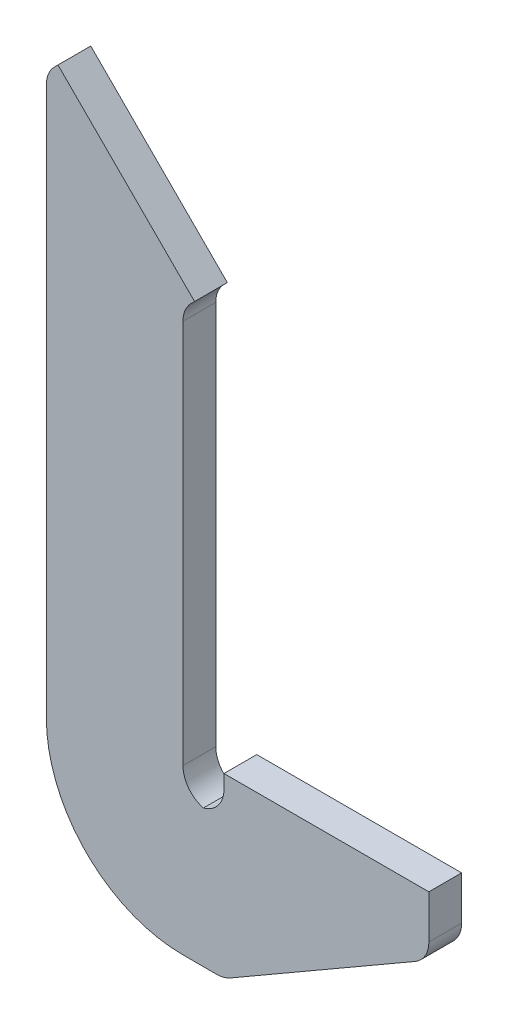
ISO-10303-21;
HEADER;
FILE_DESCRIPTION(('STEP AP214'),'2;1');
FILE_NAME('part.step','',(''),(''),'','','');
FILE_SCHEMA(('AUTOMOTIVE_DESIGN { 1 0 10303 214 1 1 1 1 }'));
ENDSEC;
DATA;
#1=APPLICATION_CONTEXT('core data for automotive mechanical design processes');
#2=APPLICATION_PROTOCOL_DEFINITION('international standard','automotive_design',2000,#1);
#3=PRODUCT_CONTEXT('',#1,'mechanical');
#4=PRODUCT('Part','Part','',(#3));
#5=PRODUCT_RELATED_PRODUCT_CATEGORY('part','',(#4));
#6=PRODUCT_DEFINITION_FORMATION('','',#4);
#7=PRODUCT_DEFINITION_CONTEXT('part definition',#1,'design');
#8=PRODUCT_DEFINITION('design','',#6,#7);
#9=PRODUCT_DEFINITION_SHAPE('','',#8);
#10=(LENGTH_UNIT() NAMED_UNIT(*) SI_UNIT(.MILLI.,.METRE.));
#11=(NAMED_UNIT(*) PLANE_ANGLE_UNIT() SI_UNIT($,.RADIAN.));
#12=(NAMED_UNIT(*) SI_UNIT($,.STERADIAN.) SOLID_ANGLE_UNIT());
#13=UNCERTAINTY_MEASURE_WITH_UNIT(LENGTH_MEASURE(1.E-05),#10,'distance_accuracy_value','');
#14=(GEOMETRIC_REPRESENTATION_CONTEXT(3) GLOBAL_UNCERTAINTY_ASSIGNED_CONTEXT((#13)) GLOBAL_UNIT_ASSIGNED_CONTEXT((#10,
#11,#12)) REPRESENTATION_CONTEXT('',''));
#15=CARTESIAN_POINT('',(0.,0.,0.));
#16=DIRECTION('',(0.,0.,1.));
#17=DIRECTION('',(1.,0.,0.));
#18=AXIS2_PLACEMENT_3D('',#15,#16,#17);
#19=CARTESIAN_POINT('',(-2.71514718625761,3.88485281374241,0.12));
#20=DIRECTION('',(0.707106781186544,-0.707106781186551,0.));
#21=DIRECTION('',(0.707106781186551,0.707106781186544,0.));
#22=AXIS2_PLACEMENT_3D('',#19,#20,#21);
#23=PLANE('',#22);
#24=DIRECTION('',(-0.707106781186551,-0.707106781186544,0.));
#25=VECTOR('',#24,1.);
#26=CARTESIAN_POINT('',(-2.71514718625761,3.88485281374241,-0.12));
#27=LINE('',#26,#25);
#28=CARTESIAN_POINT('',(-2.71514718625761,3.88485281374241,-0.12));
#29=VERTEX_POINT('',#28);
#30=CARTESIAN_POINT('',(-2.74142135623731,3.85857864376271,-0.12));
#31=VERTEX_POINT('',#30);
#32=EDGE_CURVE('E245',#29,#31,#27,.T.);
#33=ORIENTED_EDGE('',*,*,#32,.T.);
#34=DIRECTION('',(0.,0.,-1.));
#35=VECTOR('',#34,1.);
#36=CARTESIAN_POINT('',(-2.74142135623731,3.85857864376271,0.12));
#37=LINE('',#36,#35);
#38=CARTESIAN_POINT('',(-2.74142135623731,3.85857864376271,0.12));
#39=VERTEX_POINT('',#38);
#40=EDGE_CURVE('E326',#31,#39,#37,.F.);
#41=ORIENTED_EDGE('',*,*,#40,.T.);
#42=DIRECTION('',(-0.707106781186551,-0.707106781186544,0.));
#43=VECTOR('',#42,1.);
#44=CARTESIAN_POINT('',(-2.71514718625761,3.88485281374241,0.12));
#45=LINE('',#44,#43);
#46=CARTESIAN_POINT('',(-2.71514718625761,3.88485281374241,0.12));
#47=VERTEX_POINT('',#46);
#48=EDGE_CURVE('E279',#47,#39,#45,.T.);
#49=ORIENTED_EDGE('',*,*,#48,.F.);
#50=DIRECTION('',(0.,0.,-1.));
#51=VECTOR('',#50,1.);
#52=CARTESIAN_POINT('',(-2.71514718625761,3.88485281374241,0.12));
#53=LINE('',#52,#51);
#54=EDGE_CURVE('E244',#47,#29,#53,.T.);
#55=ORIENTED_EDGE('',*,*,#54,.T.);
#56=EDGE_LOOP('',(#33,#41,#49,#55));
#57=FACE_BOUND('',#56,.T.);
#58=ADVANCED_FACE('F44',(#57),#23,.F.);
#59=CARTESIAN_POINT('',(-2.8,3.80000000000002,0.12));
#60=DIRECTION('',(1.,0.,0.));
#61=DIRECTION('',(0.,1.,0.));
#62=AXIS2_PLACEMENT_3D('',#59,#60,#61);
#63=PLANE('',#62);
#64=DIRECTION('',(0.,-1.,0.));
#65=VECTOR('',#64,1.);
#66=CARTESIAN_POINT('',(-2.8,3.80000000000002,0.12));
#67=LINE('',#66,#65);
#68=CARTESIAN_POINT('',(-2.8,3.7171572875254,0.12));
#69=VERTEX_POINT('',#68);
#70=CARTESIAN_POINT('',(-2.8,-0.3,0.12));
#71=VERTEX_POINT('',#70);
#72=EDGE_CURVE('E371',#69,#71,#67,.T.);
#73=ORIENTED_EDGE('',*,*,#72,.F.);
#74=DIRECTION('',(0.,0.,-1.));
#75=VECTOR('',#74,1.);
#76=CARTESIAN_POINT('',(-2.8,3.7171572875254,0.12));
#77=LINE('',#76,#75);
#78=CARTESIAN_POINT('',(-2.8,3.7171572875254,-0.12));
#79=VERTEX_POINT('',#78);
#80=EDGE_CURVE('E313',#69,#79,#77,.T.);
#81=ORIENTED_EDGE('',*,*,#80,.T.);
#82=DIRECTION('',(0.,-1.,0.));
#83=VECTOR('',#82,1.);
#84=CARTESIAN_POINT('',(-2.8,3.80000000000002,-0.12));
#85=LINE('',#84,#83);
#86=CARTESIAN_POINT('',(-2.8,-0.3,-0.12));
#87=VERTEX_POINT('',#86);
#88=EDGE_CURVE('E249',#79,#87,#85,.T.);
#89=ORIENTED_EDGE('',*,*,#88,.T.);
#90=DIRECTION('',(0.,0.,-1.));
#91=VECTOR('',#90,1.);
#92=CARTESIAN_POINT('',(-2.8,-0.3,0.12));
#93=LINE('',#92,#91);
#94=EDGE_CURVE('E296',#87,#71,#93,.F.);
#95=ORIENTED_EDGE('',*,*,#94,.T.);
#96=EDGE_LOOP('',(#73,#81,#89,#95));
#97=FACE_BOUND('',#96,.T.);
#98=ADVANCED_FACE('F384',(#97),#63,.F.);
#99=CARTESIAN_POINT('',(-2.8,-1.3,0.12));
#100=DIRECTION('',(0.,1.,0.));
#101=DIRECTION('',(0.,0.,1.));
#102=AXIS2_PLACEMENT_3D('',#99,#100,#101);
#103=PLANE('',#102);
#104=DIRECTION('',(1.,0.,0.));
#105=VECTOR('',#104,1.);
#106=CARTESIAN_POINT('',(-2.8,-1.3,-0.12));
#107=LINE('',#106,#105);
#108=CARTESIAN_POINT('',(-1.8,-1.3,-0.12));
#109=VERTEX_POINT('',#108);
#110=CARTESIAN_POINT('',(-1.55358983848622,-1.3,-0.12));
#111=VERTEX_POINT('',#110);
#112=EDGE_CURVE('E252',#109,#111,#107,.T.);
#113=ORIENTED_EDGE('',*,*,#112,.T.);
#114=DIRECTION('',(0.,0.,-1.));
#115=VECTOR('',#114,1.);
#116=CARTESIAN_POINT('',(-1.55358983848622,-1.3,0.12));
#117=LINE('',#116,#115);
#118=CARTESIAN_POINT('',(-1.55358983848622,-1.3,0.12));
#119=VERTEX_POINT('',#118);
#120=EDGE_CURVE('E344',#111,#119,#117,.F.);
#121=ORIENTED_EDGE('',*,*,#120,.T.);
#122=DIRECTION('',(1.,0.,0.));
#123=VECTOR('',#122,1.);
#124=CARTESIAN_POINT('',(-2.8,-1.3,0.12));
#125=LINE('',#124,#123);
#126=CARTESIAN_POINT('',(-1.8,-1.3,0.12));
#127=VERTEX_POINT('',#126);
#128=EDGE_CURVE('E368',#127,#119,#125,.T.);
#129=ORIENTED_EDGE('',*,*,#128,.F.);
#130=DIRECTION('',(0.,0.,-1.));
#131=VECTOR('',#130,1.);
#132=CARTESIAN_POINT('',(-1.8,-1.3,0.12));
#133=LINE('',#132,#131);
#134=EDGE_CURVE('E220',#127,#109,#133,.T.);
#135=ORIENTED_EDGE('',*,*,#134,.T.);
#136=EDGE_LOOP('',(#113,#121,#129,#135));
#137=FACE_BOUND('',#136,.T.);
#138=ADVANCED_FACE('F391',(#137),#103,.F.);
#139=CARTESIAN_POINT('',(-1.5,-1.3,0.12));
#140=DIRECTION('',(-0.499999999999998,0.86602540378444,0.));
#141=DIRECTION('',(-0.86602540378444,-0.499999999999998,0.));
#142=AXIS2_PLACEMENT_3D('',#139,#140,#141);
#143=PLANE('',#142);
#144=DIRECTION('',(0.86602540378444,0.499999999999998,0.));
#145=VECTOR('',#144,1.);
#146=CARTESIAN_POINT('',(-1.5,-1.3,0.12));
#147=LINE('',#146,#145);
#148=CARTESIAN_POINT('',(-1.45358983848622,-1.27320508075689,0.12));
#149=VERTEX_POINT('',#148);
#150=CARTESIAN_POINT('',(-0.1,-0.491709623134528,0.12));
#151=VERTEX_POINT('',#150);
#152=EDGE_CURVE('E210',#149,#151,#147,.T.);
#153=ORIENTED_EDGE('',*,*,#152,.F.);
#154=DIRECTION('',(0.,0.,-1.));
#155=VECTOR('',#154,1.);
#156=CARTESIAN_POINT('',(-1.45358983848622,-1.27320508075689,0.12));
#157=LINE('',#156,#155);
#158=CARTESIAN_POINT('',(-1.45358983848622,-1.27320508075689,-0.12));
#159=VERTEX_POINT('',#158);
#160=EDGE_CURVE('E340',#149,#159,#157,.T.);
#161=ORIENTED_EDGE('',*,*,#160,.T.);
#162=DIRECTION('',(0.86602540378444,0.499999999999998,0.));
#163=VECTOR('',#162,1.);
#164=CARTESIAN_POINT('',(-1.5,-1.3,-0.12));
#165=LINE('',#164,#163);
#166=CARTESIAN_POINT('',(-0.1,-0.491709623134528,-0.12));
#167=VERTEX_POINT('',#166);
#168=EDGE_CURVE('E256',#159,#167,#165,.T.);
#169=ORIENTED_EDGE('',*,*,#168,.T.);
#170=DIRECTION('',(0.,0.,-1.));
#171=VECTOR('',#170,1.);
#172=CARTESIAN_POINT('',(-0.1,-0.491709623134528,0.12));
#173=LINE('',#172,#171);
#174=EDGE_CURVE('E337',#167,#151,#173,.F.);
#175=ORIENTED_EDGE('',*,*,#174,.T.);
#176=EDGE_LOOP('',(#153,#161,#169,#175));
#177=FACE_BOUND('',#176,.T.);
#178=ADVANCED_FACE('F401',(#177),#143,.F.);
#179=CARTESIAN_POINT('',(0.,-0.433974596215566,0.12));
#180=DIRECTION('',(-1.,0.,0.));
#181=DIRECTION('',(0.,-1.,0.));
#182=AXIS2_PLACEMENT_3D('',#179,#180,#181);
#183=PLANE('',#182);
#184=DIRECTION('',(0.,1.,0.));
#185=VECTOR('',#184,1.);
#186=CARTESIAN_POINT('',(0.,-0.433974596215566,0.12));
#187=LINE('',#186,#185);
#188=CARTESIAN_POINT('',(0.,-0.31850454237764,0.12));
#189=VERTEX_POINT('',#188);
#190=CARTESIAN_POINT('',(0.,0.,0.12));
#191=VERTEX_POINT('',#190);
#192=EDGE_CURVE('E196',#189,#191,#187,.T.);
#193=ORIENTED_EDGE('',*,*,#192,.F.);
#194=DIRECTION('',(0.,0.,-1.));
#195=VECTOR('',#194,1.);
#196=CARTESIAN_POINT('',(0.,-0.31850454237764,0.12));
#197=LINE('',#196,#195);
#198=CARTESIAN_POINT('',(0.,-0.31850454237764,-0.12));
#199=VERTEX_POINT('',#198);
#200=EDGE_CURVE('E347',#189,#199,#197,.T.);
#201=ORIENTED_EDGE('',*,*,#200,.T.);
#202=DIRECTION('',(0.,1.,0.));
#203=VECTOR('',#202,1.);
#204=CARTESIAN_POINT('',(0.,-0.433974596215566,-0.12));
#205=LINE('',#204,#203);
#206=CARTESIAN_POINT('',(0.,0.,-0.12));
#207=VERTEX_POINT('',#206);
#208=EDGE_CURVE('E216',#199,#207,#205,.T.);
#209=ORIENTED_EDGE('',*,*,#208,.T.);
#210=DIRECTION('',(0.,0.,-1.));
#211=VECTOR('',#210,1.);
#212=CARTESIAN_POINT('',(0.,0.,0.12));
#213=LINE('',#212,#211);
#214=EDGE_CURVE('E213',#191,#207,#213,.T.);
#215=ORIENTED_EDGE('',*,*,#214,.F.);
#216=EDGE_LOOP('',(#193,#201,#209,#215));
#217=FACE_BOUND('',#216,.T.);
#218=ADVANCED_FACE('F214',(#217),#183,.F.);
#219=CARTESIAN_POINT('',(0.,0.,0.12));
#220=DIRECTION('',(0.,-1.,0.));
#221=DIRECTION('',(0.,0.,-1.));
#222=AXIS2_PLACEMENT_3D('',#219,#220,#221);
#223=PLANE('',#222);
#224=DIRECTION('',(-1.,0.,0.));
#225=VECTOR('',#224,1.);
#226=CARTESIAN_POINT('',(0.,0.,-0.12));
#227=LINE('',#226,#225);
#228=CARTESIAN_POINT('',(-1.5,0.,-0.12));
#229=VERTEX_POINT('',#228);
#230=EDGE_CURVE('E262',#207,#229,#227,.T.);
#231=ORIENTED_EDGE('',*,*,#230,.T.);
#232=DIRECTION('',(0.,0.,-1.));
#233=VECTOR('',#232,1.);
#234=CARTESIAN_POINT('',(-1.5,0.,0.12));
#235=LINE('',#234,#233);
#236=CARTESIAN_POINT('',(-1.5,0.,0.12));
#237=VERTEX_POINT('',#236);
#238=EDGE_CURVE('E221',#237,#229,#235,.T.);
#239=ORIENTED_EDGE('',*,*,#238,.F.);
#240=DIRECTION('',(-1.,0.,0.));
#241=VECTOR('',#240,1.);
#242=CARTESIAN_POINT('',(0.,0.,0.12));
#243=LINE('',#242,#241);
#244=EDGE_CURVE('E201',#191,#237,#243,.T.);
#245=ORIENTED_EDGE('',*,*,#244,.F.);
#246=ORIENTED_EDGE('',*,*,#214,.T.);
#247=EDGE_LOOP('',(#231,#239,#245,#246));
#248=FACE_BOUND('',#247,.T.);
#249=ADVANCED_FACE('F223',(#248),#223,.F.);
#250=CARTESIAN_POINT('',(-1.5,0.,0.12));
#251=DIRECTION('',(1.,0.,0.));
#252=DIRECTION('',(0.,0.,-1.));
#253=AXIS2_PLACEMENT_3D('',#250,#251,#252);
#254=PLANE('',#253);
#255=DIRECTION('',(0.,-1.,0.));
#256=VECTOR('',#255,1.);
#257=CARTESIAN_POINT('',(-1.5,0.,-0.12));
#258=LINE('',#257,#256);
#259=CARTESIAN_POINT('',(-1.5,-0.1,-0.12));
#260=VERTEX_POINT('',#259);
#261=EDGE_CURVE('E265',#229,#260,#258,.T.);
#262=ORIENTED_EDGE('',*,*,#261,.T.);
#263=DIRECTION('',(0.,0.,-1.));
#264=VECTOR('',#263,1.);
#265=CARTESIAN_POINT('',(-1.5,-0.1,0.12));
#266=LINE('',#265,#264);
#267=CARTESIAN_POINT('',(-1.5,-0.1,0.12));
#268=VERTEX_POINT('',#267);
#269=EDGE_CURVE('E350',#260,#268,#266,.F.);
#270=ORIENTED_EDGE('',*,*,#269,.T.);
#271=DIRECTION('',(0.,-1.,0.));
#272=VECTOR('',#271,1.);
#273=CARTESIAN_POINT('',(-1.5,0.,0.12));
#274=LINE('',#273,#272);
#275=EDGE_CURVE('E227',#237,#268,#274,.T.);
#276=ORIENTED_EDGE('',*,*,#275,.F.);
#277=ORIENTED_EDGE('',*,*,#238,.T.);
#278=EDGE_LOOP('',(#262,#270,#276,#277));
#279=FACE_BOUND('',#278,.T.);
#280=ADVANCED_FACE('F407',(#279),#254,.F.);
#281=CARTESIAN_POINT('',(-1.8,-0.3,0.12));
#282=DIRECTION('',(-1.,0.,0.));
#283=DIRECTION('',(0.,0.,1.));
#284=AXIS2_PLACEMENT_3D('',#281,#282,#283);
#285=PLANE('',#284);
#286=DIRECTION('',(0.,1.,0.));
#287=VECTOR('',#286,1.);
#288=CARTESIAN_POINT('',(-1.8,-0.3,-0.12));
#289=LINE('',#288,#287);
#290=CARTESIAN_POINT('',(-1.8,-0.1,-0.12));
#291=VERTEX_POINT('',#290);
#292=CARTESIAN_POINT('',(-1.8,2.71715728752539,-0.12));
#293=VERTEX_POINT('',#292);
#294=EDGE_CURVE('E269',#291,#293,#289,.T.);
#295=ORIENTED_EDGE('',*,*,#294,.T.);
#296=DIRECTION('',(0.,0.,-1.));
#297=VECTOR('',#296,1.);
#298=CARTESIAN_POINT('',(-1.8,2.71715728752539,0.12));
#299=LINE('',#298,#297);
#300=CARTESIAN_POINT('',(-1.8,2.71715728752539,0.12));
#301=VERTEX_POINT('',#300);
#302=EDGE_CURVE('E310',#293,#301,#299,.F.);
#303=ORIENTED_EDGE('',*,*,#302,.T.);
#304=DIRECTION('',(0.,1.,0.));
#305=VECTOR('',#304,1.);
#306=CARTESIAN_POINT('',(-1.8,-0.3,0.12));
#307=LINE('',#306,#305);
#308=CARTESIAN_POINT('',(-1.8,-0.1,0.12));
#309=VERTEX_POINT('',#308);
#310=EDGE_CURVE('E231',#309,#301,#307,.T.);
#311=ORIENTED_EDGE('',*,*,#310,.F.);
#312=DIRECTION('',(0.,0.,-1.));
#313=VECTOR('',#312,1.);
#314=CARTESIAN_POINT('',(-1.8,-0.1,-0.12));
#315=LINE('',#314,#313);
#316=EDGE_CURVE('E307',#309,#291,#315,.T.);
#317=ORIENTED_EDGE('',*,*,#316,.T.);
#318=EDGE_LOOP('',(#295,#303,#311,#317));
#319=FACE_BOUND('',#318,.T.);
#320=ADVANCED_FACE('F417',(#319),#285,.F.);
#321=CARTESIAN_POINT('',(-1.8,2.80000000000001,0.12));
#322=DIRECTION('',(-0.707106781186548,0.707106781186547,0.));
#323=DIRECTION('',(-0.707106781186547,-0.707106781186548,0.));
#324=AXIS2_PLACEMENT_3D('',#321,#322,#323);
#325=PLANE('',#324);
#326=DIRECTION('',(0.707106781186547,0.707106781186548,0.));
#327=VECTOR('',#326,1.);
#328=CARTESIAN_POINT('',(-1.8,2.80000000000001,0.12));
#329=LINE('',#328,#327);
#330=CARTESIAN_POINT('',(-1.74142135623731,2.8585786437627,0.12));
#331=VERTEX_POINT('',#330);
#332=CARTESIAN_POINT('',(-1.71514718625761,2.8848528137424,0.12));
#333=VERTEX_POINT('',#332);
#334=EDGE_CURVE('E238',#331,#333,#329,.T.);
#335=ORIENTED_EDGE('',*,*,#334,.F.);
#336=DIRECTION('',(0.,0.,-1.));
#337=VECTOR('',#336,1.);
#338=CARTESIAN_POINT('',(-1.74142135623731,2.8585786437627,-0.12));
#339=LINE('',#338,#337);
#340=CARTESIAN_POINT('',(-1.74142135623731,2.8585786437627,-0.12));
#341=VERTEX_POINT('',#340);
#342=EDGE_CURVE('E303',#331,#341,#339,.T.);
#343=ORIENTED_EDGE('',*,*,#342,.T.);
#344=DIRECTION('',(0.707106781186547,0.707106781186548,0.));
#345=VECTOR('',#344,1.);
#346=CARTESIAN_POINT('',(-1.8,2.80000000000001,-0.12));
#347=LINE('',#346,#345);
#348=CARTESIAN_POINT('',(-1.71514718625761,2.8848528137424,-0.12));
#349=VERTEX_POINT('',#348);
#350=EDGE_CURVE('E273',#341,#349,#347,.T.);
#351=ORIENTED_EDGE('',*,*,#350,.T.);
#352=DIRECTION('',(0.,0.,-1.));
#353=VECTOR('',#352,1.);
#354=CARTESIAN_POINT('',(-1.71514718625761,2.8848528137424,0.12));
#355=LINE('',#354,#353);
#356=EDGE_CURVE('E283',#333,#349,#355,.T.);
#357=ORIENTED_EDGE('',*,*,#356,.F.);
#358=EDGE_LOOP('',(#335,#343,#351,#357));
#359=FACE_BOUND('',#358,.T.);
#360=ADVANCED_FACE('F425',(#359),#325,.F.);
#361=CARTESIAN_POINT('',(-1.71514718625761,2.8848528137424,0.12));
#362=DIRECTION('',(-0.707106781186551,-0.707106781186544,0.));
#363=DIRECTION('',(0.707106781186544,-0.707106781186551,0.));
#364=AXIS2_PLACEMENT_3D('',#361,#362,#363);
#365=PLANE('',#364);
#366=DIRECTION('',(-0.707106781186544,0.707106781186551,0.));
#367=VECTOR('',#366,1.);
#368=CARTESIAN_POINT('',(-1.71514718625761,2.8848528137424,-0.12));
#369=LINE('',#368,#367);
#370=EDGE_CURVE('E276',#349,#29,#369,.T.);
#371=ORIENTED_EDGE('',*,*,#370,.T.);
#372=ORIENTED_EDGE('',*,*,#54,.F.);
#373=DIRECTION('',(-0.707106781186544,0.707106781186551,0.));
#374=VECTOR('',#373,1.);
#375=CARTESIAN_POINT('',(-1.71514718625761,2.8848528137424,0.12));
#376=LINE('',#375,#374);
#377=EDGE_CURVE('E241',#333,#47,#376,.T.);
#378=ORIENTED_EDGE('',*,*,#377,.F.);
#379=ORIENTED_EDGE('',*,*,#356,.T.);
#380=EDGE_LOOP('',(#371,#372,#378,#379));
#381=FACE_BOUND('',#380,.T.);
#382=ADVANCED_FACE('F431',(#381),#365,.F.);
#383=CARTESIAN_POINT('',(0.,0.,0.12));
#384=DIRECTION('',(0.,0.,-1.));
#385=DIRECTION('',(-1.,0.,0.));
#386=AXIS2_PLACEMENT_3D('',#383,#384,#385);
#387=PLANE('',#386);
#388=ORIENTED_EDGE('',*,*,#48,.T.);
#389=CARTESIAN_POINT('',(-2.6,3.7171572875254,0.12));
#390=DIRECTION('',(0.,0.,-1.));
#391=DIRECTION('',(-1.,0.,0.));
#392=AXIS2_PLACEMENT_3D('',#389,#390,#391);
#393=CIRCLE('',#392,0.2);
#394=EDGE_CURVE('E334',#39,#69,#393,.F.);
#395=ORIENTED_EDGE('',*,*,#394,.T.);
#396=ORIENTED_EDGE('',*,*,#72,.T.);
#397=CARTESIAN_POINT('',(-1.8,-0.3,0.12));
#398=DIRECTION('',(0.,0.,-1.));
#399=DIRECTION('',(-1.,0.,0.));
#400=AXIS2_PLACEMENT_3D('',#397,#398,#399);
#401=CIRCLE('',#400,1.);
#402=EDGE_CURVE('E300',#71,#127,#401,.F.);
#403=ORIENTED_EDGE('',*,*,#402,.T.);
#404=ORIENTED_EDGE('',*,*,#128,.T.);
#405=CARTESIAN_POINT('',(-1.55358983848622,-1.1,0.12));
#406=DIRECTION('',(0.,0.,-1.));
#407=DIRECTION('',(-1.,0.,0.));
#408=AXIS2_PLACEMENT_3D('',#405,#406,#407);
#409=CIRCLE('',#408,0.2);
#410=EDGE_CURVE('E331',#119,#149,#409,.F.);
#411=ORIENTED_EDGE('',*,*,#410,.T.);
#412=ORIENTED_EDGE('',*,*,#152,.T.);
#413=CARTESIAN_POINT('',(-0.2,-0.31850454237764,0.12));
#414=DIRECTION('',(0.,0.,-1.));
#415=DIRECTION('',(-1.,0.,0.));
#416=AXIS2_PLACEMENT_3D('',#413,#414,#415);
#417=CIRCLE('',#416,0.2);
#418=EDGE_CURVE('E205',#151,#189,#417,.F.);
#419=ORIENTED_EDGE('',*,*,#418,.T.);
#420=ORIENTED_EDGE('',*,*,#192,.T.);
#421=ORIENTED_EDGE('',*,*,#244,.T.);
#422=ORIENTED_EDGE('',*,*,#275,.T.);
#423=CARTESIAN_POINT('',(-1.7,-0.1,0.12));
#424=DIRECTION('',(0.,0.,-1.));
#425=DIRECTION('',(-1.,0.,0.));
#426=AXIS2_PLACEMENT_3D('',#423,#424,#425);
#427=CIRCLE('',#426,0.2);
#428=CARTESIAN_POINT('',(-1.65,-0.293649167310371,0.12));
#429=VERTEX_POINT('',#428);
#430=EDGE_CURVE('E63',#268,#429,#427,.T.);
#431=ORIENTED_EDGE('',*,*,#430,.T.);
#432=CARTESIAN_POINT('',(-1.6,-0.1,0.12));
#433=DIRECTION('',(0.,0.,-1.));
#434=DIRECTION('',(-1.,0.,0.));
#435=AXIS2_PLACEMENT_3D('',#432,#433,#434);
#436=CIRCLE('',#435,0.2);
#437=EDGE_CURVE('E11',#429,#309,#436,.T.);
#438=ORIENTED_EDGE('',*,*,#437,.T.);
#439=ORIENTED_EDGE('',*,*,#310,.T.);
#440=CARTESIAN_POINT('',(-1.6,2.71715728752539,0.12));
#441=DIRECTION('',(0.,0.,-1.));
#442=DIRECTION('',(-1.,0.,0.));
#443=AXIS2_PLACEMENT_3D('',#440,#441,#442);
#444=CIRCLE('',#443,0.2);
#445=EDGE_CURVE('E357',#301,#331,#444,.T.);
#446=ORIENTED_EDGE('',*,*,#445,.T.);
#447=ORIENTED_EDGE('',*,*,#334,.T.);
#448=ORIENTED_EDGE('',*,*,#377,.T.);
#449=EDGE_LOOP('',(#388,#395,#396,#403,#404,#411,#412,#419,#420,#421,#422,#431,#438,#439,#446,
#447,#448));
#450=FACE_BOUND('',#449,.T.);
#451=ADVANCED_FACE('F199',(#450),#387,.F.);
#452=CARTESIAN_POINT('',(0.,0.,-0.12));
#453=DIRECTION('',(0.,0.,-1.));
#454=DIRECTION('',(-1.,0.,0.));
#455=AXIS2_PLACEMENT_3D('',#452,#453,#454);
#456=PLANE('',#455);
#457=ORIENTED_EDGE('',*,*,#88,.F.);
#458=CARTESIAN_POINT('',(-2.6,3.7171572875254,-0.12));
#459=DIRECTION('',(0.,0.,-1.));
#460=DIRECTION('',(-1.,0.,0.));
#461=AXIS2_PLACEMENT_3D('',#458,#459,#460);
#462=CIRCLE('',#461,0.2);
#463=EDGE_CURVE('E323',#79,#31,#462,.T.);
#464=ORIENTED_EDGE('',*,*,#463,.T.);
#465=ORIENTED_EDGE('',*,*,#32,.F.);
#466=ORIENTED_EDGE('',*,*,#370,.F.);
#467=ORIENTED_EDGE('',*,*,#350,.F.);
#468=CARTESIAN_POINT('',(-1.6,2.71715728752539,-0.12));
#469=DIRECTION('',(0.,0.,-1.));
#470=DIRECTION('',(-1.,0.,0.));
#471=AXIS2_PLACEMENT_3D('',#468,#469,#470);
#472=CIRCLE('',#471,0.2);
#473=EDGE_CURVE('E354',#341,#293,#472,.F.);
#474=ORIENTED_EDGE('',*,*,#473,.T.);
#475=ORIENTED_EDGE('',*,*,#294,.F.);
#476=CARTESIAN_POINT('',(-1.6,-0.1,-0.12));
#477=DIRECTION('',(0.,0.,-1.));
#478=DIRECTION('',(-1.,0.,0.));
#479=AXIS2_PLACEMENT_3D('',#476,#477,#478);
#480=CIRCLE('',#479,0.2);
#481=CARTESIAN_POINT('',(-1.65,-0.293649167310371,-0.12));
#482=VERTEX_POINT('',#481);
#483=EDGE_CURVE('E54',#291,#482,#480,.F.);
#484=ORIENTED_EDGE('',*,*,#483,.T.);
#485=CARTESIAN_POINT('',(-1.7,-0.1,-0.12));
#486=DIRECTION('',(0.,0.,-1.));
#487=DIRECTION('',(-1.,0.,0.));
#488=AXIS2_PLACEMENT_3D('',#485,#486,#487);
#489=CIRCLE('',#488,0.2);
#490=EDGE_CURVE('E360',#482,#260,#489,.F.);
#491=ORIENTED_EDGE('',*,*,#490,.T.);
#492=ORIENTED_EDGE('',*,*,#261,.F.);
#493=ORIENTED_EDGE('',*,*,#230,.F.);
#494=ORIENTED_EDGE('',*,*,#208,.F.);
#495=CARTESIAN_POINT('',(-0.2,-0.31850454237764,-0.12));
#496=DIRECTION('',(0.,0.,-1.));
#497=DIRECTION('',(-1.,0.,0.));
#498=AXIS2_PLACEMENT_3D('',#495,#496,#497);
#499=CIRCLE('',#498,0.2);
#500=EDGE_CURVE('E317',#199,#167,#499,.T.);
#501=ORIENTED_EDGE('',*,*,#500,.T.);
#502=ORIENTED_EDGE('',*,*,#168,.F.);
#503=CARTESIAN_POINT('',(-1.55358983848622,-1.1,-0.12));
#504=DIRECTION('',(0.,0.,-1.));
#505=DIRECTION('',(-1.,0.,0.));
#506=AXIS2_PLACEMENT_3D('',#503,#504,#505);
#507=CIRCLE('',#506,0.2);
#508=EDGE_CURVE('E320',#159,#111,#507,.T.);
#509=ORIENTED_EDGE('',*,*,#508,.T.);
#510=ORIENTED_EDGE('',*,*,#112,.F.);
#511=CARTESIAN_POINT('',(-1.8,-0.3,-0.12));
#512=DIRECTION('',(0.,0.,-1.));
#513=DIRECTION('',(-1.,0.,0.));
#514=AXIS2_PLACEMENT_3D('',#511,#512,#513);
#515=CIRCLE('',#514,1.);
#516=EDGE_CURVE('E292',#109,#87,#515,.T.);
#517=ORIENTED_EDGE('',*,*,#516,.T.);
#518=EDGE_LOOP('',(#457,#464,#465,#466,#467,#474,#475,#484,#491,#492,#493,#494,#501,#502,#509,
#510,#517));
#519=FACE_BOUND('',#518,.T.);
#520=ADVANCED_FACE('F393',(#519),#456,.T.);
#521=CARTESIAN_POINT('',(-1.8,-0.3,0.12));
#522=DIRECTION('',(0.,0.,-1.));
#523=DIRECTION('',(-1.,0.,0.));
#524=AXIS2_PLACEMENT_3D('',#521,#522,#523);
#525=CYLINDRICAL_SURFACE('',#524,1.);
#526=ORIENTED_EDGE('',*,*,#402,.F.);
#527=ORIENTED_EDGE('',*,*,#94,.F.);
#528=ORIENTED_EDGE('',*,*,#516,.F.);
#529=ORIENTED_EDGE('',*,*,#134,.F.);
#530=EDGE_LOOP('',(#526,#527,#528,#529));
#531=FACE_BOUND('',#530,.T.);
#532=ADVANCED_FACE('F388',(#531),#525,.T.);
#533=CARTESIAN_POINT('',(-1.6,2.71715728752539,0.12));
#534=DIRECTION('',(0.,0.,1.));
#535=DIRECTION('',(1.,0.,0.));
#536=AXIS2_PLACEMENT_3D('',#533,#534,#535);
#537=CYLINDRICAL_SURFACE('',#536,0.2);
#538=ORIENTED_EDGE('',*,*,#445,.F.);
#539=ORIENTED_EDGE('',*,*,#302,.F.);
#540=ORIENTED_EDGE('',*,*,#473,.F.);
#541=ORIENTED_EDGE('',*,*,#342,.F.);
#542=EDGE_LOOP('',(#538,#539,#540,#541));
#543=FACE_BOUND('',#542,.T.);
#544=ADVANCED_FACE('F420',(#543),#537,.F.);
#545=CARTESIAN_POINT('',(-2.6,3.7171572875254,0.12));
#546=DIRECTION('',(0.,0.,-1.));
#547=DIRECTION('',(-1.,0.,0.));
#548=AXIS2_PLACEMENT_3D('',#545,#546,#547);
#549=CYLINDRICAL_SURFACE('',#548,0.2);
#550=ORIENTED_EDGE('',*,*,#394,.F.);
#551=ORIENTED_EDGE('',*,*,#40,.F.);
#552=ORIENTED_EDGE('',*,*,#463,.F.);
#553=ORIENTED_EDGE('',*,*,#80,.F.);
#554=EDGE_LOOP('',(#550,#551,#552,#553));
#555=FACE_BOUND('',#554,.T.);
#556=ADVANCED_FACE('F436',(#555),#549,.T.);
#557=CARTESIAN_POINT('',(-1.55358983848622,-1.1,0.12));
#558=DIRECTION('',(0.,0.,-1.));
#559=DIRECTION('',(-1.,0.,0.));
#560=AXIS2_PLACEMENT_3D('',#557,#558,#559);
#561=CYLINDRICAL_SURFACE('',#560,0.2);
#562=ORIENTED_EDGE('',*,*,#410,.F.);
#563=ORIENTED_EDGE('',*,*,#120,.F.);
#564=ORIENTED_EDGE('',*,*,#508,.F.);
#565=ORIENTED_EDGE('',*,*,#160,.F.);
#566=EDGE_LOOP('',(#562,#563,#564,#565));
#567=FACE_BOUND('',#566,.T.);
#568=ADVANCED_FACE('F398',(#567),#561,.T.);
#569=CARTESIAN_POINT('',(-0.2,-0.31850454237764,0.12));
#570=DIRECTION('',(0.,0.,-1.));
#571=DIRECTION('',(-1.,0.,0.));
#572=AXIS2_PLACEMENT_3D('',#569,#570,#571);
#573=CYLINDRICAL_SURFACE('',#572,0.2);
#574=ORIENTED_EDGE('',*,*,#418,.F.);
#575=ORIENTED_EDGE('',*,*,#174,.F.);
#576=ORIENTED_EDGE('',*,*,#500,.F.);
#577=ORIENTED_EDGE('',*,*,#200,.F.);
#578=EDGE_LOOP('',(#574,#575,#576,#577));
#579=FACE_BOUND('',#578,.T.);
#580=ADVANCED_FACE('F404',(#579),#573,.T.);
#581=CARTESIAN_POINT('',(-1.6,-0.1,0.12));
#582=DIRECTION('',(0.,0.,1.));
#583=DIRECTION('',(1.,0.,0.));
#584=AXIS2_PLACEMENT_3D('',#581,#582,#583);
#585=CYLINDRICAL_SURFACE('',#584,0.2);
#586=ORIENTED_EDGE('',*,*,#316,.F.);
#587=ORIENTED_EDGE('',*,*,#437,.F.);
#588=DIRECTION('',(0.,0.,1.));
#589=VECTOR('',#588,1.);
#590=CARTESIAN_POINT('',(-1.65,-0.293649167310371,0.));
#591=LINE('',#590,#589);
#592=EDGE_CURVE('E48',#482,#429,#591,.T.);
#593=ORIENTED_EDGE('',*,*,#592,.F.);
#594=ORIENTED_EDGE('',*,*,#483,.F.);
#595=EDGE_LOOP('',(#586,#587,#593,#594));
#596=FACE_BOUND('',#595,.T.);
#597=ADVANCED_FACE('F46',(#596),#585,.F.);
#598=CARTESIAN_POINT('',(-1.7,-0.1,0.12));
#599=DIRECTION('',(0.,0.,1.));
#600=DIRECTION('',(1.,0.,0.));
#601=AXIS2_PLACEMENT_3D('',#598,#599,#600);
#602=CYLINDRICAL_SURFACE('',#601,0.2);
#603=ORIENTED_EDGE('',*,*,#430,.F.);
#604=ORIENTED_EDGE('',*,*,#269,.F.);
#605=ORIENTED_EDGE('',*,*,#490,.F.);
#606=ORIENTED_EDGE('',*,*,#592,.T.);
#607=EDGE_LOOP('',(#603,#604,#605,#606));
#608=FACE_BOUND('',#607,.T.);
#609=ADVANCED_FACE('F411',(#608),#602,.F.);
#610=CLOSED_SHELL('',(#58,#98,#138,#178,#218,#249,#280,#320,#360,#382,#451,#520,#532,#544,#556,
#568,#580,#597,#609));
#611=MANIFOLD_SOLID_BREP('B2',#610);
#612=ADVANCED_BREP_SHAPE_REPRESENTATION('',(#18,#611),#14);
#613=SHAPE_DEFINITION_REPRESENTATION(#9,#612);
ENDSEC;
END-ISO-10303-21;
